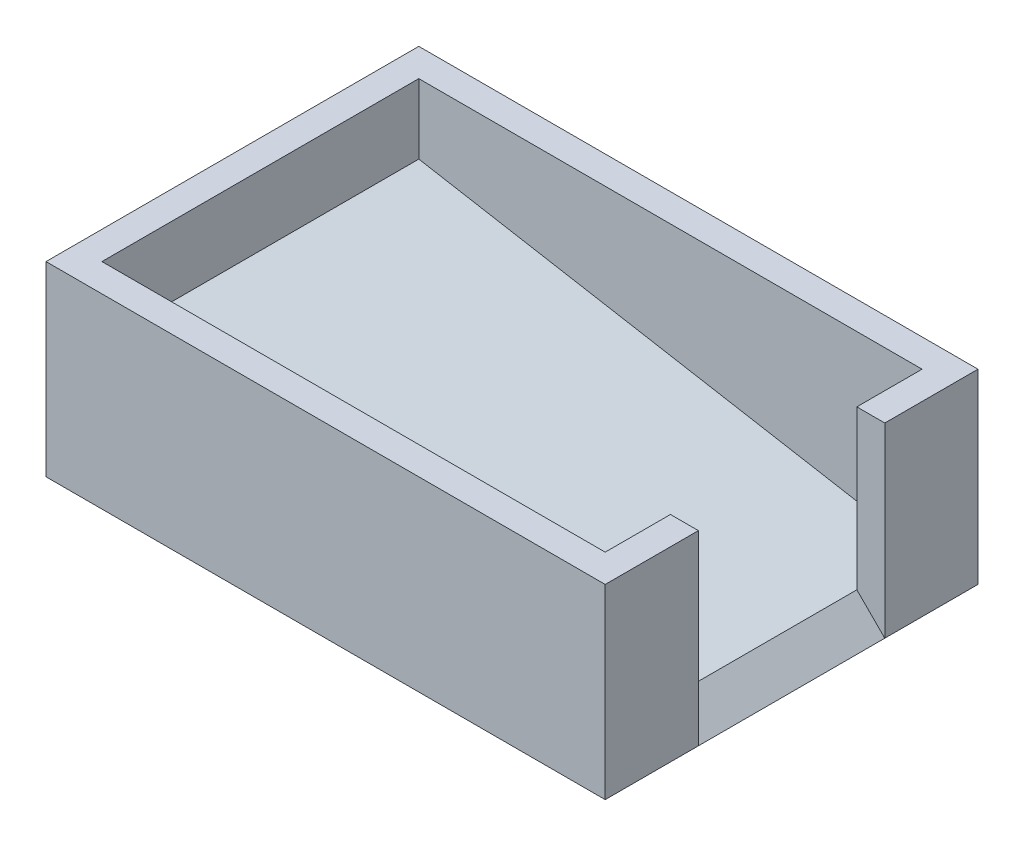
ISO-10303-21;
HEADER;
FILE_DESCRIPTION(('STEP AP214'),'2;1');
FILE_NAME('part.step','',(''),(''),'','','');
FILE_SCHEMA(('AUTOMOTIVE_DESIGN { 1 0 10303 214 1 1 1 1 }'));
ENDSEC;
DATA;
#1=APPLICATION_CONTEXT('core data for automotive mechanical design processes');
#2=APPLICATION_PROTOCOL_DEFINITION('international standard','automotive_design',2000,#1);
#3=PRODUCT_CONTEXT('',#1,'mechanical');
#4=PRODUCT('Part','Part','',(#3));
#5=PRODUCT_RELATED_PRODUCT_CATEGORY('part','',(#4));
#6=PRODUCT_DEFINITION_FORMATION('','',#4);
#7=PRODUCT_DEFINITION_CONTEXT('part definition',#1,'design');
#8=PRODUCT_DEFINITION('design','',#6,#7);
#9=PRODUCT_DEFINITION_SHAPE('','',#8);
#10=(LENGTH_UNIT() NAMED_UNIT(*) SI_UNIT(.MILLI.,.METRE.));
#11=(NAMED_UNIT(*) PLANE_ANGLE_UNIT() SI_UNIT($,.RADIAN.));
#12=(NAMED_UNIT(*) SI_UNIT($,.STERADIAN.) SOLID_ANGLE_UNIT());
#13=UNCERTAINTY_MEASURE_WITH_UNIT(LENGTH_MEASURE(1.E-05),#10,'distance_accuracy_value','');
#14=(GEOMETRIC_REPRESENTATION_CONTEXT(3) GLOBAL_UNCERTAINTY_ASSIGNED_CONTEXT((#13)) GLOBAL_UNIT_ASSIGNED_CONTEXT((#10,
#11,#12)) REPRESENTATION_CONTEXT('',''));
#15=CARTESIAN_POINT('',(0.,0.,0.));
#16=DIRECTION('',(0.,0.,1.));
#17=DIRECTION('',(1.,0.,0.));
#18=AXIS2_PLACEMENT_3D('',#15,#16,#17);
#19=CARTESIAN_POINT('',(0.,20.,17.));
#20=DIRECTION('',(0.,0.,-1.));
#21=DIRECTION('',(-1.,0.,0.));
#22=AXIS2_PLACEMENT_3D('',#19,#20,#21);
#23=PLANE('',#22);
#24=DIRECTION('',(0.,-1.,0.));
#25=VECTOR('',#24,1.);
#26=CARTESIAN_POINT('',(27.,20.,17.));
#27=LINE('',#26,#25);
#28=CARTESIAN_POINT('',(27.,20.,17.));
#29=VERTEX_POINT('',#28);
#30=CARTESIAN_POINT('',(27.,3.,17.));
#31=VERTEX_POINT('',#30);
#32=EDGE_CURVE('E236',#29,#31,#27,.T.);
#33=ORIENTED_EDGE('',*,*,#32,.T.);
#34=DIRECTION('',(0.984807753012209,-0.173648177666923,0.));
#35=VECTOR('',#34,1.);
#36=CARTESIAN_POINT('',(27.,3.,17.));
#37=LINE('',#36,#35);
#38=CARTESIAN_POINT('',(-27.,12.5216569582567,17.));
#39=VERTEX_POINT('',#38);
#40=EDGE_CURVE('E66',#39,#31,#37,.T.);
#41=ORIENTED_EDGE('',*,*,#40,.F.);
#42=DIRECTION('',(0.,-1.,0.));
#43=VECTOR('',#42,1.);
#44=CARTESIAN_POINT('',(-27.,20.,17.));
#45=LINE('',#44,#43);
#46=CARTESIAN_POINT('',(-27.,20.,17.));
#47=VERTEX_POINT('',#46);
#48=EDGE_CURVE('E256',#47,#39,#45,.T.);
#49=ORIENTED_EDGE('',*,*,#48,.F.);
#50=DIRECTION('',(1.,0.,0.));
#51=VECTOR('',#50,1.);
#52=CARTESIAN_POINT('',(0.,20.,17.));
#53=LINE('',#52,#51);
#54=EDGE_CURVE('E266',#47,#29,#53,.T.);
#55=ORIENTED_EDGE('',*,*,#54,.T.);
#56=EDGE_LOOP('',(#33,#41,#49,#55));
#57=FACE_BOUND('',#56,.T.);
#58=ADVANCED_FACE('F49',(#57),#23,.T.);
#59=CARTESIAN_POINT('',(0.,20.,-17.));
#60=DIRECTION('',(0.,0.,-1.));
#61=DIRECTION('',(-1.,0.,0.));
#62=AXIS2_PLACEMENT_3D('',#59,#60,#61);
#63=PLANE('',#62);
#64=DIRECTION('',(-0.984807753012209,0.173648177666923,0.));
#65=VECTOR('',#64,1.);
#66=CARTESIAN_POINT('',(27.,3.,-17.));
#67=LINE('',#66,#65);
#68=CARTESIAN_POINT('',(27.,3.,-17.));
#69=VERTEX_POINT('',#68);
#70=CARTESIAN_POINT('',(-27.,12.5216569582567,-17.));
#71=VERTEX_POINT('',#70);
#72=EDGE_CURVE('E332',#69,#71,#67,.T.);
#73=ORIENTED_EDGE('',*,*,#72,.F.);
#74=DIRECTION('',(0.,-1.,0.));
#75=VECTOR('',#74,1.);
#76=CARTESIAN_POINT('',(27.,20.,-17.));
#77=LINE('',#76,#75);
#78=CARTESIAN_POINT('',(27.,20.,-17.));
#79=VERTEX_POINT('',#78);
#80=EDGE_CURVE('E172',#79,#69,#77,.T.);
#81=ORIENTED_EDGE('',*,*,#80,.F.);
#82=DIRECTION('',(1.,0.,0.));
#83=VECTOR('',#82,1.);
#84=CARTESIAN_POINT('',(0.,20.,-17.));
#85=LINE('',#84,#83);
#86=CARTESIAN_POINT('',(-27.,20.,-17.));
#87=VERTEX_POINT('',#86);
#88=EDGE_CURVE('E257',#87,#79,#85,.T.);
#89=ORIENTED_EDGE('',*,*,#88,.F.);
#90=DIRECTION('',(0.,-1.,0.));
#91=VECTOR('',#90,1.);
#92=CARTESIAN_POINT('',(-27.,20.,-17.));
#93=LINE('',#92,#91);
#94=EDGE_CURVE('E269',#87,#71,#93,.T.);
#95=ORIENTED_EDGE('',*,*,#94,.T.);
#96=EDGE_LOOP('',(#73,#81,#89,#95));
#97=FACE_BOUND('',#96,.T.);
#98=ADVANCED_FACE('F343',(#97),#63,.F.);
#99=CARTESIAN_POINT('',(-27.,20.,0.));
#100=DIRECTION('',(-1.,0.,0.));
#101=DIRECTION('',(0.,0.,1.));
#102=AXIS2_PLACEMENT_3D('',#99,#100,#101);
#103=PLANE('',#102);
#104=DIRECTION('',(0.,0.,-1.));
#105=VECTOR('',#104,1.);
#106=CARTESIAN_POINT('',(-27.,12.5216569582567,20.002));
#107=LINE('',#106,#105);
#108=EDGE_CURVE('E73',#39,#71,#107,.T.);
#109=ORIENTED_EDGE('',*,*,#108,.T.);
#110=ORIENTED_EDGE('',*,*,#94,.F.);
#111=DIRECTION('',(0.,0.,-1.));
#112=VECTOR('',#111,1.);
#113=CARTESIAN_POINT('',(-27.,20.,0.));
#114=LINE('',#113,#112);
#115=EDGE_CURVE('E252',#47,#87,#114,.T.);
#116=ORIENTED_EDGE('',*,*,#115,.F.);
#117=ORIENTED_EDGE('',*,*,#48,.T.);
#118=EDGE_LOOP('',(#109,#110,#116,#117));
#119=FACE_BOUND('',#118,.T.);
#120=ADVANCED_FACE('F345',(#119),#103,.F.);
#121=CARTESIAN_POINT('',(30.,20.,0.));
#122=DIRECTION('',(-1.,0.,0.));
#123=DIRECTION('',(0.,0.,1.));
#124=AXIS2_PLACEMENT_3D('',#121,#122,#123);
#125=PLANE('',#124);
#126=DIRECTION('',(0.,1.,0.));
#127=VECTOR('',#126,1.);
#128=CARTESIAN_POINT('',(30.,20.,-10.));
#129=LINE('',#128,#127);
#130=CARTESIAN_POINT('',(30.,0.,-10.));
#131=VERTEX_POINT('',#130);
#132=CARTESIAN_POINT('',(30.,20.,-10.));
#133=VERTEX_POINT('',#132);
#134=EDGE_CURVE('E327',#131,#133,#129,.T.);
#135=ORIENTED_EDGE('',*,*,#134,.F.);
#136=DIRECTION('',(0.,0.,-1.));
#137=VECTOR('',#136,1.);
#138=CARTESIAN_POINT('',(30.,0.,0.));
#139=LINE('',#138,#137);
#140=CARTESIAN_POINT('',(30.,0.,-20.));
#141=VERTEX_POINT('',#140);
#142=EDGE_CURVE('E231',#131,#141,#139,.T.);
#143=ORIENTED_EDGE('',*,*,#142,.T.);
#144=DIRECTION('',(0.,-1.,0.));
#145=VECTOR('',#144,1.);
#146=CARTESIAN_POINT('',(30.,20.,-20.));
#147=LINE('',#146,#145);
#148=CARTESIAN_POINT('',(30.,20.,-20.));
#149=VERTEX_POINT('',#148);
#150=EDGE_CURVE('E205',#149,#141,#147,.T.);
#151=ORIENTED_EDGE('',*,*,#150,.F.);
#152=DIRECTION('',(0.,0.,-1.));
#153=VECTOR('',#152,1.);
#154=CARTESIAN_POINT('',(30.,20.,0.));
#155=LINE('',#154,#153);
#156=EDGE_CURVE('E248',#133,#149,#155,.T.);
#157=ORIENTED_EDGE('',*,*,#156,.F.);
#158=EDGE_LOOP('',(#135,#143,#151,#157));
#159=FACE_BOUND('',#158,.T.);
#160=ADVANCED_FACE('F369',(#159),#125,.F.);
#161=CARTESIAN_POINT('',(27.,20.,0.));
#162=DIRECTION('',(-1.,0.,0.));
#163=DIRECTION('',(0.,0.,1.));
#164=AXIS2_PLACEMENT_3D('',#161,#162,#163);
#165=PLANE('',#164);
#166=DIRECTION('',(0.,-1.,0.));
#167=VECTOR('',#166,1.);
#168=CARTESIAN_POINT('',(27.,20.,10.));
#169=LINE('',#168,#167);
#170=CARTESIAN_POINT('',(27.,20.,10.));
#171=VERTEX_POINT('',#170);
#172=CARTESIAN_POINT('',(27.,3.,10.));
#173=VERTEX_POINT('',#172);
#174=EDGE_CURVE('E188',#171,#173,#169,.T.);
#175=ORIENTED_EDGE('',*,*,#174,.T.);
#176=DIRECTION('',(0.,0.,-1.));
#177=VECTOR('',#176,1.);
#178=CARTESIAN_POINT('',(27.,3.,0.));
#179=LINE('',#178,#177);
#180=EDGE_CURVE('E177',#31,#173,#179,.T.);
#181=ORIENTED_EDGE('',*,*,#180,.F.);
#182=ORIENTED_EDGE('',*,*,#32,.F.);
#183=DIRECTION('',(0.,0.,-1.));
#184=VECTOR('',#183,1.);
#185=CARTESIAN_POINT('',(27.,20.,0.));
#186=LINE('',#185,#184);
#187=EDGE_CURVE('E261',#29,#171,#186,.T.);
#188=ORIENTED_EDGE('',*,*,#187,.T.);
#189=EDGE_LOOP('',(#175,#181,#182,#188));
#190=FACE_BOUND('',#189,.T.);
#191=ADVANCED_FACE('F353',(#190),#165,.T.);
#192=CARTESIAN_POINT('',(0.,20.,20.));
#193=DIRECTION('',(0.,0.,-1.));
#194=DIRECTION('',(-1.,0.,0.));
#195=AXIS2_PLACEMENT_3D('',#192,#193,#194);
#196=PLANE('',#195);
#197=DIRECTION('',(1.,0.,0.));
#198=VECTOR('',#197,1.);
#199=CARTESIAN_POINT('',(0.,0.,20.));
#200=LINE('',#199,#198);
#201=CARTESIAN_POINT('',(-30.,0.,20.));
#202=VERTEX_POINT('',#201);
#203=CARTESIAN_POINT('',(30.,0.,20.));
#204=VERTEX_POINT('',#203);
#205=EDGE_CURVE('E232',#202,#204,#200,.T.);
#206=ORIENTED_EDGE('',*,*,#205,.T.);
#207=DIRECTION('',(0.,-1.,0.));
#208=VECTOR('',#207,1.);
#209=CARTESIAN_POINT('',(30.,20.,20.));
#210=LINE('',#209,#208);
#211=CARTESIAN_POINT('',(30.,20.,20.));
#212=VERTEX_POINT('',#211);
#213=EDGE_CURVE('E201',#212,#204,#210,.T.);
#214=ORIENTED_EDGE('',*,*,#213,.F.);
#215=DIRECTION('',(1.,0.,0.));
#216=VECTOR('',#215,1.);
#217=CARTESIAN_POINT('',(0.,20.,20.));
#218=LINE('',#217,#216);
#219=CARTESIAN_POINT('',(-30.,20.,20.));
#220=VERTEX_POINT('',#219);
#221=EDGE_CURVE('E222',#220,#212,#218,.T.);
#222=ORIENTED_EDGE('',*,*,#221,.F.);
#223=DIRECTION('',(0.,-1.,0.));
#224=VECTOR('',#223,1.);
#225=CARTESIAN_POINT('',(-30.,20.,20.));
#226=LINE('',#225,#224);
#227=EDGE_CURVE('E214',#220,#202,#226,.T.);
#228=ORIENTED_EDGE('',*,*,#227,.T.);
#229=EDGE_LOOP('',(#206,#214,#222,#228));
#230=FACE_BOUND('',#229,.T.);
#231=ADVANCED_FACE('F381',(#230),#196,.F.);
#232=CARTESIAN_POINT('',(30.,0.,10.));
#233=VERTEX_POINT('',#232);
#234=EDGE_CURVE('E227',#204,#233,#139,.T.);
#235=ORIENTED_EDGE('',*,*,#234,.T.);
#236=DIRECTION('',(0.,-1.,0.));
#237=VECTOR('',#236,1.);
#238=CARTESIAN_POINT('',(30.,20.,10.));
#239=LINE('',#238,#237);
#240=CARTESIAN_POINT('',(30.,20.,10.));
#241=VERTEX_POINT('',#240);
#242=EDGE_CURVE('E330',#241,#233,#239,.T.);
#243=ORIENTED_EDGE('',*,*,#242,.F.);
#244=EDGE_CURVE('E244',#212,#241,#155,.T.);
#245=ORIENTED_EDGE('',*,*,#244,.F.);
#246=ORIENTED_EDGE('',*,*,#213,.T.);
#247=EDGE_LOOP('',(#235,#243,#245,#246));
#248=FACE_BOUND('',#247,.T.);
#249=ADVANCED_FACE('F361',(#248),#125,.F.);
#250=CARTESIAN_POINT('',(0.,20.,-20.));
#251=DIRECTION('',(0.,0.,-1.));
#252=DIRECTION('',(-1.,0.,0.));
#253=AXIS2_PLACEMENT_3D('',#250,#251,#252);
#254=PLANE('',#253);
#255=DIRECTION('',(1.,0.,0.));
#256=VECTOR('',#255,1.);
#257=CARTESIAN_POINT('',(0.,0.,-20.));
#258=LINE('',#257,#256);
#259=CARTESIAN_POINT('',(-30.,0.,-20.));
#260=VERTEX_POINT('',#259);
#261=EDGE_CURVE('E223',#260,#141,#258,.T.);
#262=ORIENTED_EDGE('',*,*,#261,.F.);
#263=DIRECTION('',(0.,-1.,0.));
#264=VECTOR('',#263,1.);
#265=CARTESIAN_POINT('',(-30.,20.,-20.));
#266=LINE('',#265,#264);
#267=CARTESIAN_POINT('',(-30.,20.,-20.));
#268=VERTEX_POINT('',#267);
#269=EDGE_CURVE('E211',#268,#260,#266,.T.);
#270=ORIENTED_EDGE('',*,*,#269,.F.);
#271=DIRECTION('',(1.,0.,0.));
#272=VECTOR('',#271,1.);
#273=CARTESIAN_POINT('',(0.,20.,-20.));
#274=LINE('',#273,#272);
#275=EDGE_CURVE('E240',#268,#149,#274,.T.);
#276=ORIENTED_EDGE('',*,*,#275,.T.);
#277=ORIENTED_EDGE('',*,*,#150,.T.);
#278=EDGE_LOOP('',(#262,#270,#276,#277));
#279=FACE_BOUND('',#278,.T.);
#280=ADVANCED_FACE('F373',(#279),#254,.T.);
#281=CARTESIAN_POINT('',(-30.,20.,0.));
#282=DIRECTION('',(-1.,0.,0.));
#283=DIRECTION('',(0.,0.,1.));
#284=AXIS2_PLACEMENT_3D('',#281,#282,#283);
#285=PLANE('',#284);
#286=DIRECTION('',(0.,0.,-1.));
#287=VECTOR('',#286,1.);
#288=CARTESIAN_POINT('',(-30.,0.,0.));
#289=LINE('',#288,#287);
#290=EDGE_CURVE('E218',#202,#260,#289,.T.);
#291=ORIENTED_EDGE('',*,*,#290,.F.);
#292=ORIENTED_EDGE('',*,*,#227,.F.);
#293=DIRECTION('',(0.,0.,-1.));
#294=VECTOR('',#293,1.);
#295=CARTESIAN_POINT('',(-30.,20.,0.));
#296=LINE('',#295,#294);
#297=EDGE_CURVE('E217',#220,#268,#296,.T.);
#298=ORIENTED_EDGE('',*,*,#297,.T.);
#299=ORIENTED_EDGE('',*,*,#269,.T.);
#300=EDGE_LOOP('',(#291,#292,#298,#299));
#301=FACE_BOUND('',#300,.T.);
#302=ADVANCED_FACE('F377',(#301),#285,.T.);
#303=CARTESIAN_POINT('',(0.,20.,0.));
#304=DIRECTION('',(0.,1.,0.));
#305=DIRECTION('',(0.,0.,1.));
#306=AXIS2_PLACEMENT_3D('',#303,#304,#305);
#307=PLANE('',#306);
#308=DIRECTION('',(1.,0.,0.));
#309=VECTOR('',#308,1.);
#310=CARTESIAN_POINT('',(27.,20.,10.));
#311=LINE('',#310,#309);
#312=EDGE_CURVE('E310',#171,#241,#311,.T.);
#313=ORIENTED_EDGE('',*,*,#312,.F.);
#314=ORIENTED_EDGE('',*,*,#187,.F.);
#315=ORIENTED_EDGE('',*,*,#54,.F.);
#316=ORIENTED_EDGE('',*,*,#115,.T.);
#317=ORIENTED_EDGE('',*,*,#88,.T.);
#318=CARTESIAN_POINT('',(27.,20.,-10.));
#319=VERTEX_POINT('',#318);
#320=EDGE_CURVE('E265',#319,#79,#186,.T.);
#321=ORIENTED_EDGE('',*,*,#320,.F.);
#322=DIRECTION('',(1.,0.,0.));
#323=VECTOR('',#322,1.);
#324=CARTESIAN_POINT('',(27.,20.,-10.));
#325=LINE('',#324,#323);
#326=EDGE_CURVE('E186',#319,#133,#325,.T.);
#327=ORIENTED_EDGE('',*,*,#326,.T.);
#328=ORIENTED_EDGE('',*,*,#156,.T.);
#329=ORIENTED_EDGE('',*,*,#275,.F.);
#330=ORIENTED_EDGE('',*,*,#297,.F.);
#331=ORIENTED_EDGE('',*,*,#221,.T.);
#332=ORIENTED_EDGE('',*,*,#244,.T.);
#333=EDGE_LOOP('',(#313,#314,#315,#316,#317,#321,#327,#328,#329,#330,#331,#332));
#334=FACE_BOUND('',#333,.T.);
#335=ADVANCED_FACE('F349',(#334),#307,.T.);
#336=CARTESIAN_POINT('',(0.,0.,0.));
#337=DIRECTION('',(0.,1.,0.));
#338=DIRECTION('',(0.,0.,1.));
#339=AXIS2_PLACEMENT_3D('',#336,#337,#338);
#340=PLANE('',#339);
#341=DIRECTION('',(0.,0.,-1.));
#342=VECTOR('',#341,1.);
#343=CARTESIAN_POINT('',(-9.5,0.,0.));
#344=LINE('',#343,#342);
#345=CARTESIAN_POINT('',(-9.5,0.,7.5));
#346=VERTEX_POINT('',#345);
#347=CARTESIAN_POINT('',(-9.5,0.,-7.5));
#348=VERTEX_POINT('',#347);
#349=EDGE_CURVE('E295',#346,#348,#344,.T.);
#350=ORIENTED_EDGE('',*,*,#349,.F.);
#351=DIRECTION('',(1.,0.,0.));
#352=VECTOR('',#351,1.);
#353=CARTESIAN_POINT('',(0.,0.,7.5));
#354=LINE('',#353,#352);
#355=CARTESIAN_POINT('',(9.5,0.,7.5));
#356=VERTEX_POINT('',#355);
#357=EDGE_CURVE('E307',#346,#356,#354,.T.);
#358=ORIENTED_EDGE('',*,*,#357,.T.);
#359=DIRECTION('',(0.,0.,-1.));
#360=VECTOR('',#359,1.);
#361=CARTESIAN_POINT('',(9.5,0.,0.));
#362=LINE('',#361,#360);
#363=CARTESIAN_POINT('',(9.5,0.,-7.5));
#364=VERTEX_POINT('',#363);
#365=EDGE_CURVE('E304',#356,#364,#362,.T.);
#366=ORIENTED_EDGE('',*,*,#365,.T.);
#367=DIRECTION('',(1.,0.,0.));
#368=VECTOR('',#367,1.);
#369=CARTESIAN_POINT('',(0.,0.,-7.5));
#370=LINE('',#369,#368);
#371=EDGE_CURVE('E300',#348,#364,#370,.T.);
#372=ORIENTED_EDGE('',*,*,#371,.F.);
#373=EDGE_LOOP('',(#350,#358,#366,#372));
#374=FACE_BOUND('',#373,.T.);
#375=ORIENTED_EDGE('',*,*,#205,.F.);
#376=ORIENTED_EDGE('',*,*,#290,.T.);
#377=ORIENTED_EDGE('',*,*,#261,.T.);
#378=ORIENTED_EDGE('',*,*,#142,.F.);
#379=EDGE_CURVE('E197',#233,#131,#139,.T.);
#380=ORIENTED_EDGE('',*,*,#379,.F.);
#381=ORIENTED_EDGE('',*,*,#234,.F.);
#382=EDGE_LOOP('',(#375,#376,#377,#378,#380,#381));
#383=FACE_BOUND('',#382,.T.);
#384=ADVANCED_FACE('F364',(#374,#383),#340,.F.);
#385=DIRECTION('',(0.,1.,0.));
#386=VECTOR('',#385,1.);
#387=CARTESIAN_POINT('',(27.,20.,-10.));
#388=LINE('',#387,#386);
#389=CARTESIAN_POINT('',(27.,3.,-10.));
#390=VERTEX_POINT('',#389);
#391=EDGE_CURVE('E169',#390,#319,#388,.T.);
#392=ORIENTED_EDGE('',*,*,#391,.T.);
#393=ORIENTED_EDGE('',*,*,#320,.T.);
#394=ORIENTED_EDGE('',*,*,#80,.T.);
#395=EDGE_CURVE('E166',#390,#69,#179,.T.);
#396=ORIENTED_EDGE('',*,*,#395,.F.);
#397=EDGE_LOOP('',(#392,#393,#394,#396));
#398=FACE_BOUND('',#397,.T.);
#399=ADVANCED_FACE('F168',(#398),#165,.T.);
#400=CARTESIAN_POINT('',(0.,-3.,7.5));
#401=DIRECTION('',(0.,0.,1.));
#402=DIRECTION('',(1.,0.,0.));
#403=AXIS2_PLACEMENT_3D('',#400,#401,#402);
#404=PLANE('',#403);
#405=ORIENTED_EDGE('',*,*,#357,.F.);
#406=DIRECTION('',(0.,1.,0.));
#407=VECTOR('',#406,1.);
#408=CARTESIAN_POINT('',(-9.5,-3.,7.5));
#409=LINE('',#408,#407);
#410=CARTESIAN_POINT('',(-9.5,-3.,7.5));
#411=VERTEX_POINT('',#410);
#412=EDGE_CURVE('E178',#411,#346,#409,.T.);
#413=ORIENTED_EDGE('',*,*,#412,.F.);
#414=DIRECTION('',(1.,0.,0.));
#415=VECTOR('',#414,1.);
#416=CARTESIAN_POINT('',(0.,-3.,7.5));
#417=LINE('',#416,#415);
#418=CARTESIAN_POINT('',(9.5,-3.,7.5));
#419=VERTEX_POINT('',#418);
#420=EDGE_CURVE('E299',#411,#419,#417,.T.);
#421=ORIENTED_EDGE('',*,*,#420,.T.);
#422=DIRECTION('',(0.,1.,0.));
#423=VECTOR('',#422,1.);
#424=CARTESIAN_POINT('',(9.5,-3.,7.5));
#425=LINE('',#424,#423);
#426=EDGE_CURVE('E279',#419,#356,#425,.T.);
#427=ORIENTED_EDGE('',*,*,#426,.T.);
#428=EDGE_LOOP('',(#405,#413,#421,#427));
#429=FACE_BOUND('',#428,.T.);
#430=ADVANCED_FACE('F396',(#429),#404,.T.);
#431=CARTESIAN_POINT('',(-9.5,-3.,0.));
#432=DIRECTION('',(1.,0.,0.));
#433=DIRECTION('',(0.,0.,-1.));
#434=AXIS2_PLACEMENT_3D('',#431,#432,#433);
#435=PLANE('',#434);
#436=ORIENTED_EDGE('',*,*,#349,.T.);
#437=DIRECTION('',(0.,1.,0.));
#438=VECTOR('',#437,1.);
#439=CARTESIAN_POINT('',(-9.5,-3.,-7.5));
#440=LINE('',#439,#438);
#441=CARTESIAN_POINT('',(-9.5,-3.,-7.5));
#442=VERTEX_POINT('',#441);
#443=EDGE_CURVE('E288',#442,#348,#440,.T.);
#444=ORIENTED_EDGE('',*,*,#443,.F.);
#445=DIRECTION('',(0.,0.,-1.));
#446=VECTOR('',#445,1.);
#447=CARTESIAN_POINT('',(-9.5,-3.,0.));
#448=LINE('',#447,#446);
#449=EDGE_CURVE('E284',#411,#442,#448,.T.);
#450=ORIENTED_EDGE('',*,*,#449,.F.);
#451=ORIENTED_EDGE('',*,*,#412,.T.);
#452=EDGE_LOOP('',(#436,#444,#450,#451));
#453=FACE_BOUND('',#452,.T.);
#454=ADVANCED_FACE('F441',(#453),#435,.F.);
#455=CARTESIAN_POINT('',(0.,-3.,-7.5));
#456=DIRECTION('',(0.,0.,1.));
#457=DIRECTION('',(1.,0.,0.));
#458=AXIS2_PLACEMENT_3D('',#455,#456,#457);
#459=PLANE('',#458);
#460=ORIENTED_EDGE('',*,*,#371,.T.);
#461=DIRECTION('',(0.,1.,0.));
#462=VECTOR('',#461,1.);
#463=CARTESIAN_POINT('',(9.5,-3.,-7.5));
#464=LINE('',#463,#462);
#465=CARTESIAN_POINT('',(9.5,-3.,-7.5));
#466=VERTEX_POINT('',#465);
#467=EDGE_CURVE('E283',#466,#364,#464,.T.);
#468=ORIENTED_EDGE('',*,*,#467,.F.);
#469=DIRECTION('',(1.,0.,0.));
#470=VECTOR('',#469,1.);
#471=CARTESIAN_POINT('',(0.,-3.,-7.5));
#472=LINE('',#471,#470);
#473=EDGE_CURVE('E313',#442,#466,#472,.T.);
#474=ORIENTED_EDGE('',*,*,#473,.F.);
#475=ORIENTED_EDGE('',*,*,#443,.T.);
#476=EDGE_LOOP('',(#460,#468,#474,#475));
#477=FACE_BOUND('',#476,.T.);
#478=ADVANCED_FACE('F448',(#477),#459,.F.);
#479=CARTESIAN_POINT('',(9.5,-3.,0.));
#480=DIRECTION('',(1.,0.,0.));
#481=DIRECTION('',(0.,0.,-1.));
#482=AXIS2_PLACEMENT_3D('',#479,#480,#481);
#483=PLANE('',#482);
#484=ORIENTED_EDGE('',*,*,#365,.F.);
#485=ORIENTED_EDGE('',*,*,#426,.F.);
#486=DIRECTION('',(0.,0.,-1.));
#487=VECTOR('',#486,1.);
#488=CARTESIAN_POINT('',(9.5,-3.,0.));
#489=LINE('',#488,#487);
#490=EDGE_CURVE('E316',#419,#466,#489,.T.);
#491=ORIENTED_EDGE('',*,*,#490,.T.);
#492=ORIENTED_EDGE('',*,*,#467,.T.);
#493=EDGE_LOOP('',(#484,#485,#491,#492));
#494=FACE_BOUND('',#493,.T.);
#495=ADVANCED_FACE('F456',(#494),#483,.T.);
#496=CARTESIAN_POINT('',(0.,-3.,0.));
#497=DIRECTION('',(0.,1.,0.));
#498=DIRECTION('',(0.,0.,1.));
#499=AXIS2_PLACEMENT_3D('',#496,#497,#498);
#500=PLANE('',#499);
#501=ORIENTED_EDGE('',*,*,#420,.F.);
#502=ORIENTED_EDGE('',*,*,#449,.T.);
#503=ORIENTED_EDGE('',*,*,#473,.T.);
#504=ORIENTED_EDGE('',*,*,#490,.F.);
#505=EDGE_LOOP('',(#501,#502,#503,#504));
#506=FACE_BOUND('',#505,.T.);
#507=ADVANCED_FACE('F464',(#506),#500,.F.);
#508=CARTESIAN_POINT('',(27.,20.,10.));
#509=DIRECTION('',(0.,0.,1.));
#510=DIRECTION('',(1.,0.,0.));
#511=AXIS2_PLACEMENT_3D('',#508,#509,#510);
#512=PLANE('',#511);
#513=ORIENTED_EDGE('',*,*,#242,.T.);
#514=DIRECTION('',(-0.707106781186546,0.707106781186549,0.));
#515=VECTOR('',#514,1.);
#516=CARTESIAN_POINT('',(18.5,11.5,10.));
#517=LINE('',#516,#515);
#518=EDGE_CURVE('E11',#233,#173,#517,.T.);
#519=ORIENTED_EDGE('',*,*,#518,.T.);
#520=ORIENTED_EDGE('',*,*,#174,.F.);
#521=ORIENTED_EDGE('',*,*,#312,.T.);
#522=EDGE_LOOP('',(#513,#519,#520,#521));
#523=FACE_BOUND('',#522,.T.);
#524=ADVANCED_FACE('F355',(#523),#512,.F.);
#525=CARTESIAN_POINT('',(27.,20.,-10.));
#526=DIRECTION('',(0.,0.,-1.));
#527=DIRECTION('',(-1.,0.,0.));
#528=AXIS2_PLACEMENT_3D('',#525,#526,#527);
#529=PLANE('',#528);
#530=ORIENTED_EDGE('',*,*,#134,.T.);
#531=ORIENTED_EDGE('',*,*,#326,.F.);
#532=ORIENTED_EDGE('',*,*,#391,.F.);
#533=DIRECTION('',(0.707106781186546,-0.707106781186549,0.));
#534=VECTOR('',#533,1.);
#535=CARTESIAN_POINT('',(18.5,11.5,-10.));
#536=LINE('',#535,#534);
#537=EDGE_CURVE('E59',#390,#131,#536,.T.);
#538=ORIENTED_EDGE('',*,*,#537,.T.);
#539=EDGE_LOOP('',(#530,#531,#532,#538));
#540=FACE_BOUND('',#539,.T.);
#541=ADVANCED_FACE('F183',(#540),#529,.F.);
#542=CARTESIAN_POINT('',(27.,3.,0.));
#543=DIRECTION('',(0.707106781186549,0.707106781186546,0.));
#544=DIRECTION('',(0.,0.,1.));
#545=AXIS2_PLACEMENT_3D('',#542,#543,#544);
#546=PLANE('',#545);
#547=ORIENTED_EDGE('',*,*,#518,.F.);
#548=ORIENTED_EDGE('',*,*,#379,.T.);
#549=ORIENTED_EDGE('',*,*,#537,.F.);
#550=DIRECTION('',(0.,0.,-1.));
#551=VECTOR('',#550,1.);
#552=CARTESIAN_POINT('',(27.,3.,-10.));
#553=LINE('',#552,#551);
#554=EDGE_CURVE('E194',#173,#390,#553,.T.);
#555=ORIENTED_EDGE('',*,*,#554,.F.);
#556=EDGE_LOOP('',(#547,#548,#549,#555));
#557=FACE_BOUND('',#556,.T.);
#558=ADVANCED_FACE('F52',(#557),#546,.T.);
#559=CARTESIAN_POINT('',(27.,3.,20.002));
#560=DIRECTION('',(-0.173648177666923,-0.984807753012209,0.));
#561=DIRECTION('',(0.984807753012209,-0.173648177666923,0.));
#562=AXIS2_PLACEMENT_3D('',#559,#560,#561);
#563=PLANE('',#562);
#564=ORIENTED_EDGE('',*,*,#108,.F.);
#565=ORIENTED_EDGE('',*,*,#40,.T.);
#566=ORIENTED_EDGE('',*,*,#180,.T.);
#567=ORIENTED_EDGE('',*,*,#554,.T.);
#568=ORIENTED_EDGE('',*,*,#395,.T.);
#569=ORIENTED_EDGE('',*,*,#72,.T.);
#570=EDGE_LOOP('',(#564,#565,#566,#567,#568,#569));
#571=FACE_BOUND('',#570,.T.);
#572=ADVANCED_FACE('F199',(#571),#563,.F.);
#573=CLOSED_SHELL('',(#58,#98,#120,#160,#191,#231,#249,#280,#302,#335,#384,#399,#430,#454,#478,
#495,#507,#524,#541,#558,#572));
#574=MANIFOLD_SOLID_BREP('B2',#573);
#575=ADVANCED_BREP_SHAPE_REPRESENTATION('',(#18,#574),#14);
#576=SHAPE_DEFINITION_REPRESENTATION(#9,#575);
ENDSEC;
END-ISO-10303-21;
